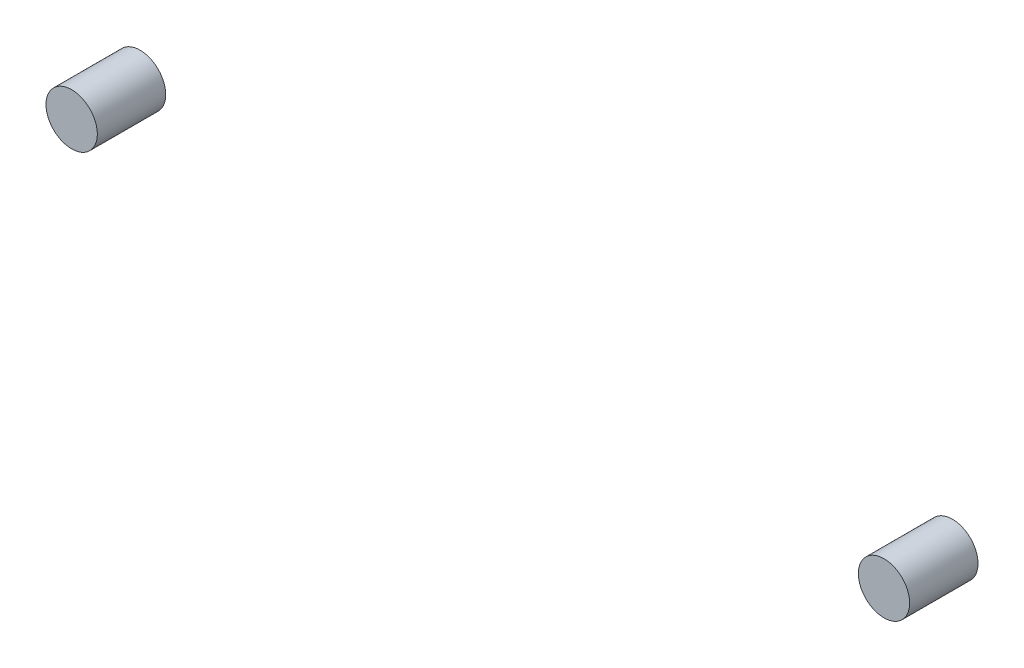
ISO-10303-21;
HEADER;
FILE_DESCRIPTION(('STEP AP214'),'2;1');
FILE_NAME('part.step','',(''),(''),'','','');
FILE_SCHEMA(('AUTOMOTIVE_DESIGN { 1 0 10303 214 1 1 1 1 }'));
ENDSEC;
DATA;
#1=APPLICATION_CONTEXT('core data for automotive mechanical design processes');
#2=APPLICATION_PROTOCOL_DEFINITION('international standard','automotive_design',2000,#1);
#3=PRODUCT_CONTEXT('',#1,'mechanical');
#4=PRODUCT('Part','Part','',(#3));
#5=PRODUCT_RELATED_PRODUCT_CATEGORY('part','',(#4));
#6=PRODUCT_DEFINITION_FORMATION('','',#4);
#7=PRODUCT_DEFINITION_CONTEXT('part definition',#1,'design');
#8=PRODUCT_DEFINITION('design','',#6,#7);
#9=PRODUCT_DEFINITION_SHAPE('','',#8);
#10=(LENGTH_UNIT() NAMED_UNIT(*) SI_UNIT(.MILLI.,.METRE.));
#11=(NAMED_UNIT(*) PLANE_ANGLE_UNIT() SI_UNIT($,.RADIAN.));
#12=(NAMED_UNIT(*) SI_UNIT($,.STERADIAN.) SOLID_ANGLE_UNIT());
#13=UNCERTAINTY_MEASURE_WITH_UNIT(LENGTH_MEASURE(1.E-05),#10,'distance_accuracy_value','');
#14=(GEOMETRIC_REPRESENTATION_CONTEXT(3) GLOBAL_UNCERTAINTY_ASSIGNED_CONTEXT((#13)) GLOBAL_UNIT_ASSIGNED_CONTEXT((#10,
#11,#12)) REPRESENTATION_CONTEXT('',''));
#15=CARTESIAN_POINT('',(0.,0.,0.));
#16=DIRECTION('',(0.,0.,1.));
#17=DIRECTION('',(1.,0.,0.));
#18=AXIS2_PLACEMENT_3D('',#15,#16,#17);
#19=CARTESIAN_POINT('',(301.625,0.,12.7));
#20=DIRECTION('',(0.,0.,-1.));
#21=DIRECTION('',(-1.,0.,0.));
#22=AXIS2_PLACEMENT_3D('',#19,#20,#21);
#23=CYLINDRICAL_SURFACE('',#22,9.52500000000002);
#24=CARTESIAN_POINT('',(301.625,0.,12.7));
#25=DIRECTION('',(0.,0.,1.));
#26=DIRECTION('',(1.,0.,0.));
#27=AXIS2_PLACEMENT_3D('',#24,#25,#26);
#28=CIRCLE('',#27,9.52500000000002);
#29=CARTESIAN_POINT('',(292.1,0.,12.7));
#30=VERTEX_POINT('',#29);
#31=EDGE_CURVE('E11',#30,#30,#28,.T.);
#32=CARTESIAN_POINT('',(301.625,0.,-12.7));
#33=DIRECTION('',(0.,0.,1.));
#34=DIRECTION('',(1.,0.,0.));
#35=AXIS2_PLACEMENT_3D('',#32,#33,#34);
#36=CIRCLE('',#35,9.52500000000002);
#37=CARTESIAN_POINT('',(292.1,0.,-12.7));
#38=VERTEX_POINT('',#37);
#39=EDGE_CURVE('E42',#38,#38,#36,.T.);
#40=CARTESIAN_POINT('',(292.1,0.,12.7));
#41=CARTESIAN_POINT('',(292.1,0.,12.4354166666667));
#42=CARTESIAN_POINT('',(292.1,0.,12.1708333333333));
#43=CARTESIAN_POINT('',(292.1,0.,11.6416666666667));
#44=CARTESIAN_POINT('',(292.1,0.,11.3770833333333));
#45=CARTESIAN_POINT('',(292.1,0.,10.8479166666667));
#46=CARTESIAN_POINT('',(292.1,0.,10.5833333333333));
#47=CARTESIAN_POINT('',(292.1,0.,10.0541666666667));
#48=CARTESIAN_POINT('',(292.1,0.,9.78958333333333));
#49=CARTESIAN_POINT('',(292.1,0.,9.26041666666667));
#50=CARTESIAN_POINT('',(292.1,0.,8.99583333333333));
#51=CARTESIAN_POINT('',(292.1,0.,8.46666666666667));
#52=CARTESIAN_POINT('',(292.1,0.,8.20208333333333));
#53=CARTESIAN_POINT('',(292.1,0.,7.67291666666667));
#54=CARTESIAN_POINT('',(292.1,0.,7.40833333333333));
#55=CARTESIAN_POINT('',(292.1,0.,6.87916666666667));
#56=CARTESIAN_POINT('',(292.1,0.,6.61458333333333));
#57=CARTESIAN_POINT('',(292.1,0.,6.08541666666667));
#58=CARTESIAN_POINT('',(292.1,0.,5.82083333333333));
#59=CARTESIAN_POINT('',(292.1,0.,5.29166666666667));
#60=CARTESIAN_POINT('',(292.1,0.,5.02708333333333));
#61=CARTESIAN_POINT('',(292.1,0.,4.49791666666667));
#62=CARTESIAN_POINT('',(292.1,0.,4.23333333333333));
#63=CARTESIAN_POINT('',(292.1,0.,3.70416666666667));
#64=CARTESIAN_POINT('',(292.1,0.,3.43958333333333));
#65=CARTESIAN_POINT('',(292.1,0.,2.91041666666667));
#66=CARTESIAN_POINT('',(292.1,0.,2.64583333333333));
#67=CARTESIAN_POINT('',(292.1,0.,2.11666666666667));
#68=CARTESIAN_POINT('',(292.1,0.,1.85208333333333));
#69=CARTESIAN_POINT('',(292.1,0.,1.32291666666667));
#70=CARTESIAN_POINT('',(292.1,0.,1.05833333333333));
#71=CARTESIAN_POINT('',(292.1,0.,0.529166666666666));
#72=CARTESIAN_POINT('',(292.1,0.,0.264583333333333));
#73=CARTESIAN_POINT('',(292.1,0.,-0.264583333333333));
#74=CARTESIAN_POINT('',(292.1,0.,-0.529166666666666));
#75=CARTESIAN_POINT('',(292.1,0.,-1.05833333333333));
#76=CARTESIAN_POINT('',(292.1,0.,-1.32291666666667));
#77=CARTESIAN_POINT('',(292.1,0.,-1.85208333333333));
#78=CARTESIAN_POINT('',(292.1,0.,-2.11666666666667));
#79=CARTESIAN_POINT('',(292.1,0.,-2.64583333333333));
#80=CARTESIAN_POINT('',(292.1,0.,-2.91041666666667));
#81=CARTESIAN_POINT('',(292.1,0.,-3.43958333333333));
#82=CARTESIAN_POINT('',(292.1,0.,-3.70416666666667));
#83=CARTESIAN_POINT('',(292.1,0.,-4.23333333333333));
#84=CARTESIAN_POINT('',(292.1,0.,-4.49791666666667));
#85=CARTESIAN_POINT('',(292.1,0.,-5.02708333333333));
#86=CARTESIAN_POINT('',(292.1,0.,-5.29166666666667));
#87=CARTESIAN_POINT('',(292.1,0.,-5.82083333333333));
#88=CARTESIAN_POINT('',(292.1,0.,-6.08541666666667));
#89=CARTESIAN_POINT('',(292.1,0.,-6.61458333333333));
#90=CARTESIAN_POINT('',(292.1,0.,-6.87916666666667));
#91=CARTESIAN_POINT('',(292.1,0.,-7.40833333333333));
#92=CARTESIAN_POINT('',(292.1,0.,-7.67291666666667));
#93=CARTESIAN_POINT('',(292.1,0.,-8.20208333333333));
#94=CARTESIAN_POINT('',(292.1,0.,-8.46666666666667));
#95=CARTESIAN_POINT('',(292.1,0.,-8.99583333333334));
#96=CARTESIAN_POINT('',(292.1,0.,-9.26041666666667));
#97=CARTESIAN_POINT('',(292.1,0.,-9.78958333333333));
#98=CARTESIAN_POINT('',(292.1,0.,-10.0541666666667));
#99=CARTESIAN_POINT('',(292.1,0.,-10.5833333333333));
#100=CARTESIAN_POINT('',(292.1,0.,-10.8479166666667));
#101=CARTESIAN_POINT('',(292.1,0.,-11.3770833333333));
#102=CARTESIAN_POINT('',(292.1,0.,-11.6416666666667));
#103=CARTESIAN_POINT('',(292.1,0.,-12.1708333333333));
#104=CARTESIAN_POINT('',(292.1,0.,-12.4354166666667));
#105=CARTESIAN_POINT('',(292.1,0.,-12.7));
#106=B_SPLINE_CURVE_WITH_KNOTS('',3,(#40,#41,#42,#43,#44,#45,#46,#47,#48,#49,#50,#51,#52,#53,
#54,#55,#56,#57,#58,#59,#60,#61,#62,#63,#64,#65,#66,#67,#68,#69,#70,#71,#72,#73,#74,#75,#76,#77,
#78,#79,#80,#81,#82,#83,#84,#85,#86,#87,#88,#89,#90,#91,#92,#93,#94,#95,#96,#97,#98,#99,#100,
#101,#102,#103,#104,#105),.UNSPECIFIED.,.F.,.F.,(4,2,2,2,2,2,2,2,2,2,2,2,2,2,2,2,2,2,2,2,2,2,2,
2,2,2,2,2,2,2,2,2,4),(0.,0.793750000000001,1.5875,2.38125,3.175,3.96875,4.7625,5.55625,6.35,
7.14375,7.9375,8.73125,9.525,10.31875,11.1125,11.90625,12.7,13.49375,14.2875,15.08125,15.875,
16.66875,17.4625,18.25625,19.05,19.84375,20.6375,21.43125,22.225,23.01875,23.8125,24.60625,
25.4),.UNSPECIFIED.);
#107=EDGE_CURVE('BSEAM39',#30,#38,#106,.T.);
#108=ORIENTED_EDGE('',*,*,#31,.F.);
#109=ORIENTED_EDGE('',*,*,#39,.T.);
#110=ORIENTED_EDGE('',*,*,#107,.T.);
#111=ORIENTED_EDGE('',*,*,#107,.F.);
#112=EDGE_LOOP('',(#108,#110,#109,#111));
#113=FACE_BOUND('',#112,.T.);
#114=ADVANCED_FACE('F39',(#113),#23,.T.);
#115=CARTESIAN_POINT('',(301.625,0.,12.7));
#116=DIRECTION('',(0.,0.,1.));
#117=DIRECTION('',(1.,0.,0.));
#118=AXIS2_PLACEMENT_3D('',#115,#116,#117);
#119=PLANE('',#118);
#120=ORIENTED_EDGE('',*,*,#31,.T.);
#121=EDGE_LOOP('',(#120));
#122=FACE_BOUND('',#121,.T.);
#123=ADVANCED_FACE('F54',(#122),#119,.T.);
#124=CARTESIAN_POINT('',(301.625,0.,-12.7));
#125=DIRECTION('',(0.,0.,1.));
#126=DIRECTION('',(1.,0.,0.));
#127=AXIS2_PLACEMENT_3D('',#124,#125,#126);
#128=PLANE('',#127);
#129=ORIENTED_EDGE('',*,*,#39,.F.);
#130=EDGE_LOOP('',(#129));
#131=FACE_BOUND('',#130,.T.);
#132=ADVANCED_FACE('F52',(#131),#128,.F.);
#133=CLOSED_SHELL('',(#114,#123,#132));
#134=MANIFOLD_SOLID_BREP('B2',#133);
#135=CARTESIAN_POINT('',(0.,0.,12.7));
#136=DIRECTION('',(0.,0.,-1.));
#137=DIRECTION('',(-1.,0.,0.));
#138=AXIS2_PLACEMENT_3D('',#135,#136,#137);
#139=CYLINDRICAL_SURFACE('',#138,9.525);
#140=CARTESIAN_POINT('',(0.,0.,12.7));
#141=DIRECTION('',(0.,0.,1.));
#142=DIRECTION('',(1.,0.,0.));
#143=AXIS2_PLACEMENT_3D('',#140,#141,#142);
#144=CIRCLE('',#143,9.525);
#145=CARTESIAN_POINT('',(-9.525,0.,12.7));
#146=VERTEX_POINT('',#145);
#147=EDGE_CURVE('E38',#146,#146,#144,.T.);
#148=CARTESIAN_POINT('',(0.,0.,-12.7));
#149=DIRECTION('',(0.,0.,1.));
#150=DIRECTION('',(1.,0.,0.));
#151=AXIS2_PLACEMENT_3D('',#148,#149,#150);
#152=CIRCLE('',#151,9.525);
#153=CARTESIAN_POINT('',(-9.525,0.,-12.7));
#154=VERTEX_POINT('',#153);
#155=EDGE_CURVE('E83',#154,#154,#152,.T.);
#156=CARTESIAN_POINT('',(-9.525,0.,12.7));
#157=CARTESIAN_POINT('',(-9.525,0.,12.4354166666667));
#158=CARTESIAN_POINT('',(-9.525,0.,12.1708333333333));
#159=CARTESIAN_POINT('',(-9.525,0.,11.6416666666667));
#160=CARTESIAN_POINT('',(-9.525,0.,11.3770833333333));
#161=CARTESIAN_POINT('',(-9.525,0.,10.8479166666667));
#162=CARTESIAN_POINT('',(-9.525,0.,10.5833333333333));
#163=CARTESIAN_POINT('',(-9.525,0.,10.0541666666667));
#164=CARTESIAN_POINT('',(-9.525,0.,9.78958333333333));
#165=CARTESIAN_POINT('',(-9.525,0.,9.26041666666667));
#166=CARTESIAN_POINT('',(-9.525,0.,8.99583333333333));
#167=CARTESIAN_POINT('',(-9.525,0.,8.46666666666667));
#168=CARTESIAN_POINT('',(-9.525,0.,8.20208333333333));
#169=CARTESIAN_POINT('',(-9.525,0.,7.67291666666667));
#170=CARTESIAN_POINT('',(-9.525,0.,7.40833333333333));
#171=CARTESIAN_POINT('',(-9.525,0.,6.87916666666667));
#172=CARTESIAN_POINT('',(-9.525,0.,6.61458333333333));
#173=CARTESIAN_POINT('',(-9.525,0.,6.08541666666667));
#174=CARTESIAN_POINT('',(-9.525,0.,5.82083333333333));
#175=CARTESIAN_POINT('',(-9.525,0.,5.29166666666667));
#176=CARTESIAN_POINT('',(-9.525,0.,5.02708333333333));
#177=CARTESIAN_POINT('',(-9.525,0.,4.49791666666667));
#178=CARTESIAN_POINT('',(-9.525,0.,4.23333333333333));
#179=CARTESIAN_POINT('',(-9.525,0.,3.70416666666667));
#180=CARTESIAN_POINT('',(-9.525,0.,3.43958333333333));
#181=CARTESIAN_POINT('',(-9.525,0.,2.91041666666667));
#182=CARTESIAN_POINT('',(-9.525,0.,2.64583333333333));
#183=CARTESIAN_POINT('',(-9.525,0.,2.11666666666667));
#184=CARTESIAN_POINT('',(-9.525,0.,1.85208333333333));
#185=CARTESIAN_POINT('',(-9.525,0.,1.32291666666667));
#186=CARTESIAN_POINT('',(-9.525,0.,1.05833333333333));
#187=CARTESIAN_POINT('',(-9.525,0.,0.529166666666666));
#188=CARTESIAN_POINT('',(-9.525,0.,0.264583333333333));
#189=CARTESIAN_POINT('',(-9.525,0.,-0.264583333333333));
#190=CARTESIAN_POINT('',(-9.525,0.,-0.529166666666666));
#191=CARTESIAN_POINT('',(-9.525,0.,-1.05833333333333));
#192=CARTESIAN_POINT('',(-9.525,0.,-1.32291666666667));
#193=CARTESIAN_POINT('',(-9.525,0.,-1.85208333333333));
#194=CARTESIAN_POINT('',(-9.525,0.,-2.11666666666667));
#195=CARTESIAN_POINT('',(-9.525,0.,-2.64583333333333));
#196=CARTESIAN_POINT('',(-9.525,0.,-2.91041666666667));
#197=CARTESIAN_POINT('',(-9.525,0.,-3.43958333333333));
#198=CARTESIAN_POINT('',(-9.525,0.,-3.70416666666667));
#199=CARTESIAN_POINT('',(-9.525,0.,-4.23333333333333));
#200=CARTESIAN_POINT('',(-9.525,0.,-4.49791666666667));
#201=CARTESIAN_POINT('',(-9.525,0.,-5.02708333333333));
#202=CARTESIAN_POINT('',(-9.525,0.,-5.29166666666667));
#203=CARTESIAN_POINT('',(-9.525,0.,-5.82083333333333));
#204=CARTESIAN_POINT('',(-9.525,0.,-6.08541666666667));
#205=CARTESIAN_POINT('',(-9.525,0.,-6.61458333333333));
#206=CARTESIAN_POINT('',(-9.525,0.,-6.87916666666667));
#207=CARTESIAN_POINT('',(-9.525,0.,-7.40833333333333));
#208=CARTESIAN_POINT('',(-9.525,0.,-7.67291666666667));
#209=CARTESIAN_POINT('',(-9.525,0.,-8.20208333333333));
#210=CARTESIAN_POINT('',(-9.525,0.,-8.46666666666667));
#211=CARTESIAN_POINT('',(-9.525,0.,-8.99583333333334));
#212=CARTESIAN_POINT('',(-9.525,0.,-9.26041666666667));
#213=CARTESIAN_POINT('',(-9.525,0.,-9.78958333333333));
#214=CARTESIAN_POINT('',(-9.525,0.,-10.0541666666667));
#215=CARTESIAN_POINT('',(-9.525,0.,-10.5833333333333));
#216=CARTESIAN_POINT('',(-9.525,0.,-10.8479166666667));
#217=CARTESIAN_POINT('',(-9.525,0.,-11.3770833333333));
#218=CARTESIAN_POINT('',(-9.525,0.,-11.6416666666667));
#219=CARTESIAN_POINT('',(-9.525,0.,-12.1708333333333));
#220=CARTESIAN_POINT('',(-9.525,0.,-12.4354166666667));
#221=CARTESIAN_POINT('',(-9.525,0.,-12.7));
#222=B_SPLINE_CURVE_WITH_KNOTS('',3,(#156,#157,#158,#159,#160,#161,#162,#163,#164,#165,#166,
#167,#168,#169,#170,#171,#172,#173,#174,#175,#176,#177,#178,#179,#180,#181,#182,#183,#184,#185,
#186,#187,#188,#189,#190,#191,#192,#193,#194,#195,#196,#197,#198,#199,#200,#201,#202,#203,#204,
#205,#206,#207,#208,#209,#210,#211,#212,#213,#214,#215,#216,#217,#218,#219,#220,#221),
.UNSPECIFIED.,.F.,.F.,(4,2,2,2,2,2,2,2,2,2,2,2,2,2,2,2,2,2,2,2,2,2,2,2,2,2,2,2,2,2,2,2,4),(0.,
0.793750000000001,1.5875,2.38125,3.175,3.96875,4.7625,5.55625,6.35,7.14375,7.9375,8.73125,9.525,
10.31875,11.1125,11.90625,12.7,13.49375,14.2875,15.08125,15.875,16.66875,17.4625,18.25625,19.05,
19.84375,20.6375,21.43125,22.225,23.01875,23.8125,24.60625,25.4),.UNSPECIFIED.);
#223=EDGE_CURVE('BSEAM80',#146,#154,#222,.T.);
#224=ORIENTED_EDGE('',*,*,#147,.F.);
#225=ORIENTED_EDGE('',*,*,#155,.T.);
#226=ORIENTED_EDGE('',*,*,#223,.T.);
#227=ORIENTED_EDGE('',*,*,#223,.F.);
#228=EDGE_LOOP('',(#224,#226,#225,#227));
#229=FACE_BOUND('',#228,.T.);
#230=ADVANCED_FACE('F80',(#229),#139,.T.);
#231=CARTESIAN_POINT('',(0.,0.,12.7));
#232=DIRECTION('',(0.,0.,1.));
#233=DIRECTION('',(1.,0.,0.));
#234=AXIS2_PLACEMENT_3D('',#231,#232,#233);
#235=PLANE('',#234);
#236=ORIENTED_EDGE('',*,*,#147,.T.);
#237=EDGE_LOOP('',(#236));
#238=FACE_BOUND('',#237,.T.);
#239=ADVANCED_FACE('F95',(#238),#235,.T.);
#240=CARTESIAN_POINT('',(0.,0.,-12.7));
#241=DIRECTION('',(0.,0.,1.));
#242=DIRECTION('',(1.,0.,0.));
#243=AXIS2_PLACEMENT_3D('',#240,#241,#242);
#244=PLANE('',#243);
#245=ORIENTED_EDGE('',*,*,#155,.F.);
#246=EDGE_LOOP('',(#245));
#247=FACE_BOUND('',#246,.T.);
#248=ADVANCED_FACE('F93',(#247),#244,.F.);
#249=CLOSED_SHELL('',(#230,#239,#248));
#250=MANIFOLD_SOLID_BREP('B6',#249);
#251=ADVANCED_BREP_SHAPE_REPRESENTATION('',(#18,#134,#250),#14);
#252=SHAPE_DEFINITION_REPRESENTATION(#9,#251);
ENDSEC;
END-ISO-10303-21;
